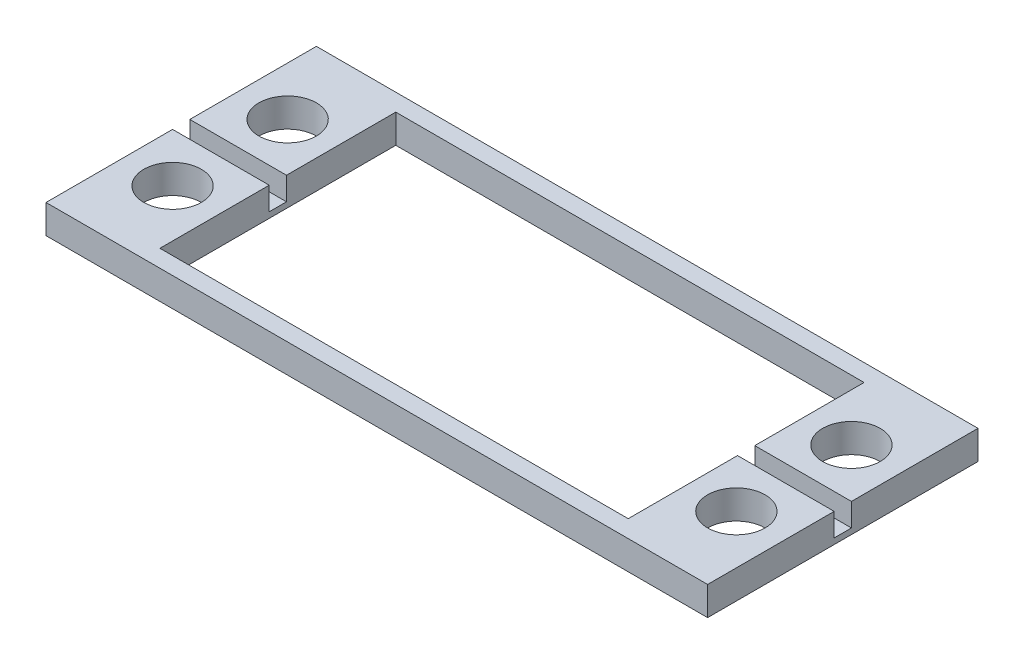
ISO-10303-21;
HEADER;
FILE_DESCRIPTION(('STEP AP214'),'2;1');
FILE_NAME('part.step','',(''),(''),'','','');
FILE_SCHEMA(('AUTOMOTIVE_DESIGN { 1 0 10303 214 1 1 1 1 }'));
ENDSEC;
DATA;
#1=APPLICATION_CONTEXT('core data for automotive mechanical design processes');
#2=APPLICATION_PROTOCOL_DEFINITION('international standard','automotive_design',2000,#1);
#3=PRODUCT_CONTEXT('',#1,'mechanical');
#4=PRODUCT('Part','Part','',(#3));
#5=PRODUCT_RELATED_PRODUCT_CATEGORY('part','',(#4));
#6=PRODUCT_DEFINITION_FORMATION('','',#4);
#7=PRODUCT_DEFINITION_CONTEXT('part definition',#1,'design');
#8=PRODUCT_DEFINITION('design','',#6,#7);
#9=PRODUCT_DEFINITION_SHAPE('','',#8);
#10=(LENGTH_UNIT() NAMED_UNIT(*) SI_UNIT(.MILLI.,.METRE.));
#11=(NAMED_UNIT(*) PLANE_ANGLE_UNIT() SI_UNIT($,.RADIAN.));
#12=(NAMED_UNIT(*) SI_UNIT($,.STERADIAN.) SOLID_ANGLE_UNIT());
#13=UNCERTAINTY_MEASURE_WITH_UNIT(LENGTH_MEASURE(1.E-05),#10,'distance_accuracy_value','');
#14=(GEOMETRIC_REPRESENTATION_CONTEXT(3) GLOBAL_UNCERTAINTY_ASSIGNED_CONTEXT((#13)) GLOBAL_UNIT_ASSIGNED_CONTEXT((#10,
#11,#12)) REPRESENTATION_CONTEXT('',''));
#15=CARTESIAN_POINT('',(0.,0.,0.));
#16=DIRECTION('',(0.,0.,1.));
#17=DIRECTION('',(1.,0.,0.));
#18=AXIS2_PLACEMENT_3D('',#15,#16,#17);
#19=CARTESIAN_POINT('',(0.,2.5,0.));
#20=DIRECTION('',(0.,-1.,0.));
#21=DIRECTION('',(0.,0.,-1.));
#22=AXIS2_PLACEMENT_3D('',#19,#20,#21);
#23=PLANE('',#22);
#24=CARTESIAN_POINT('',(-72.4290830339133,2.5,-41.8099213211178));
#25=DIRECTION('',(0.,1.,0.));
#26=DIRECTION('',(0.,0.,-1.));
#27=AXIS2_PLACEMENT_3D('',#24,#25,#26);
#28=CIRCLE('',#27,2.5);
#29=CARTESIAN_POINT('',(-72.4290830339133,2.5,-44.3099213211178));
#30=VERTEX_POINT('',#29);
#31=EDGE_CURVE('E197',#30,#30,#28,.T.);
#32=ORIENTED_EDGE('',*,*,#31,.F.);
#33=EDGE_LOOP('',(#32));
#34=FACE_BOUND('',#33,.T.);
#35=CARTESIAN_POINT('',(-23.4290830339133,2.5,-41.8099213211178));
#36=DIRECTION('',(0.,1.,0.));
#37=DIRECTION('',(0.,0.,1.));
#38=AXIS2_PLACEMENT_3D('',#35,#36,#37);
#39=CIRCLE('',#38,2.5);
#40=CARTESIAN_POINT('',(-23.4290830339133,2.5,-39.3099213211178));
#41=VERTEX_POINT('',#40);
#42=EDGE_CURVE('E217',#41,#41,#39,.T.);
#43=ORIENTED_EDGE('',*,*,#42,.F.);
#44=EDGE_LOOP('',(#43));
#45=FACE_BOUND('',#44,.T.);
#46=DIRECTION('',(0.,0.,-1.));
#47=VECTOR('',#46,1.);
#48=CARTESIAN_POINT('',(-27.5790830339133,2.5,-47.0599213211178));
#49=LINE('',#48,#47);
#50=CARTESIAN_POINT('',(-27.5790830339133,2.5,-37.5599213211178));
#51=VERTEX_POINT('',#50);
#52=CARTESIAN_POINT('',(-27.5790830339133,2.5,-47.0599213211178));
#53=VERTEX_POINT('',#52);
#54=EDGE_CURVE('E225',#51,#53,#49,.T.);
#55=ORIENTED_EDGE('',*,*,#54,.F.);
#56=DIRECTION('',(-1.,0.,0.));
#57=VECTOR('',#56,1.);
#58=CARTESIAN_POINT('',(-19.1790830339133,2.5,-37.5599213211178));
#59=LINE('',#58,#57);
#60=CARTESIAN_POINT('',(-19.1790830339133,2.5,-37.5599213211178));
#61=VERTEX_POINT('',#60);
#62=EDGE_CURVE('E153',#61,#51,#59,.T.);
#63=ORIENTED_EDGE('',*,*,#62,.F.);
#64=DIRECTION('',(0.,0.,-1.));
#65=VECTOR('',#64,1.);
#66=CARTESIAN_POINT('',(-19.1790830339133,2.5,-25.0599213211178));
#67=LINE('',#66,#65);
#68=CARTESIAN_POINT('',(-19.1790830339133,2.5,-48.5599213211178));
#69=VERTEX_POINT('',#68);
#70=EDGE_CURVE('E259',#61,#69,#67,.T.);
#71=ORIENTED_EDGE('',*,*,#70,.T.);
#72=DIRECTION('',(-1.,0.,0.));
#73=VECTOR('',#72,1.);
#74=CARTESIAN_POINT('',(-76.6790830339133,2.5,-48.5599213211178));
#75=LINE('',#74,#73);
#76=CARTESIAN_POINT('',(-76.6790830339133,2.5,-48.5599213211178));
#77=VERTEX_POINT('',#76);
#78=EDGE_CURVE('E258',#69,#77,#75,.T.);
#79=ORIENTED_EDGE('',*,*,#78,.T.);
#80=DIRECTION('',(0.,0.,1.));
#81=VECTOR('',#80,1.);
#82=CARTESIAN_POINT('',(-76.6790830339133,2.5,-25.0599213211178));
#83=LINE('',#82,#81);
#84=CARTESIAN_POINT('',(-76.6790830339133,2.5,-37.5599213211179));
#85=VERTEX_POINT('',#84);
#86=EDGE_CURVE('E262',#77,#85,#83,.T.);
#87=ORIENTED_EDGE('',*,*,#86,.T.);
#88=DIRECTION('',(-1.,0.,0.));
#89=VECTOR('',#88,1.);
#90=CARTESIAN_POINT('',(-76.6790830339133,2.5,-37.5599213211179));
#91=LINE('',#90,#89);
#92=CARTESIAN_POINT('',(-68.2790830339133,2.5,-37.5599213211179));
#93=VERTEX_POINT('',#92);
#94=EDGE_CURVE('E176',#93,#85,#91,.T.);
#95=ORIENTED_EDGE('',*,*,#94,.F.);
#96=DIRECTION('',(0.,0.,1.));
#97=VECTOR('',#96,1.);
#98=CARTESIAN_POINT('',(-68.2790830339133,2.5,-47.0599213211178));
#99=LINE('',#98,#97);
#100=CARTESIAN_POINT('',(-68.2790830339133,2.5,-47.0599213211178));
#101=VERTEX_POINT('',#100);
#102=EDGE_CURVE('E228',#101,#93,#99,.T.);
#103=ORIENTED_EDGE('',*,*,#102,.F.);
#104=DIRECTION('',(-1.,0.,0.));
#105=VECTOR('',#104,1.);
#106=CARTESIAN_POINT('',(-68.2790830339133,2.5,-47.0599213211178));
#107=LINE('',#106,#105);
#108=EDGE_CURVE('E224',#53,#101,#107,.T.);
#109=ORIENTED_EDGE('',*,*,#108,.F.);
#110=EDGE_LOOP('',(#55,#63,#71,#79,#87,#95,#103,#109));
#111=FACE_BOUND('',#110,.T.);
#112=ADVANCED_FACE('F33',(#34,#45,#111),#23,.F.);
#113=CARTESIAN_POINT('',(-19.1790830339133,2.5,-25.0599213211178));
#114=VERTEX_POINT('',#113);
#115=CARTESIAN_POINT('',(-19.1790830339133,2.5,-36.0599213211178));
#116=VERTEX_POINT('',#115);
#117=EDGE_CURVE('E255',#114,#116,#67,.T.);
#118=ORIENTED_EDGE('',*,*,#117,.T.);
#119=DIRECTION('',(1.,0.,0.));
#120=VECTOR('',#119,1.);
#121=CARTESIAN_POINT('',(-27.5790830339133,2.5,-36.0599213211178));
#122=LINE('',#121,#120);
#123=CARTESIAN_POINT('',(-27.5790830339133,2.5,-36.0599213211178));
#124=VERTEX_POINT('',#123);
#125=EDGE_CURVE('E190',#124,#116,#122,.T.);
#126=ORIENTED_EDGE('',*,*,#125,.F.);
#127=CARTESIAN_POINT('',(-27.5790830339133,2.5,-26.5599213211178));
#128=VERTEX_POINT('',#127);
#129=EDGE_CURVE('E167',#128,#124,#49,.T.);
#130=ORIENTED_EDGE('',*,*,#129,.F.);
#131=DIRECTION('',(1.,0.,0.));
#132=VECTOR('',#131,1.);
#133=CARTESIAN_POINT('',(-68.2790830339133,2.5,-26.5599213211178));
#134=LINE('',#133,#132);
#135=CARTESIAN_POINT('',(-68.2790830339133,2.5,-26.5599213211178));
#136=VERTEX_POINT('',#135);
#137=EDGE_CURVE('E231',#136,#128,#134,.T.);
#138=ORIENTED_EDGE('',*,*,#137,.F.);
#139=CARTESIAN_POINT('',(-68.2790830339133,2.5,-36.0599213211179));
#140=VERTEX_POINT('',#139);
#141=EDGE_CURVE('E227',#140,#136,#99,.T.);
#142=ORIENTED_EDGE('',*,*,#141,.F.);
#143=DIRECTION('',(1.,0.,0.));
#144=VECTOR('',#143,1.);
#145=CARTESIAN_POINT('',(-68.2790830339133,2.5,-36.0599213211179));
#146=LINE('',#145,#144);
#147=CARTESIAN_POINT('',(-76.6790830339133,2.5,-36.0599213211179));
#148=VERTEX_POINT('',#147);
#149=EDGE_CURVE('E184',#148,#140,#146,.T.);
#150=ORIENTED_EDGE('',*,*,#149,.F.);
#151=CARTESIAN_POINT('',(-76.6790830339133,2.5,-25.0599213211178));
#152=VERTEX_POINT('',#151);
#153=EDGE_CURVE('E261',#148,#152,#83,.T.);
#154=ORIENTED_EDGE('',*,*,#153,.T.);
#155=DIRECTION('',(1.,0.,0.));
#156=VECTOR('',#155,1.);
#157=CARTESIAN_POINT('',(-76.6790830339133,2.5,-25.0599213211178));
#158=LINE('',#157,#156);
#159=EDGE_CURVE('E265',#152,#114,#158,.T.);
#160=ORIENTED_EDGE('',*,*,#159,.T.);
#161=EDGE_LOOP('',(#118,#126,#130,#138,#142,#150,#154,#160));
#162=FACE_BOUND('',#161,.T.);
#163=CARTESIAN_POINT('',(-23.4290830339133,2.5,-31.8099213211178));
#164=DIRECTION('',(0.,1.,0.));
#165=DIRECTION('',(0.,0.,-1.));
#166=AXIS2_PLACEMENT_3D('',#163,#164,#165);
#167=CIRCLE('',#166,2.5);
#168=CARTESIAN_POINT('',(-23.4290830339133,2.5,-34.3099213211178));
#169=VERTEX_POINT('',#168);
#170=EDGE_CURVE('E211',#169,#169,#167,.T.);
#171=ORIENTED_EDGE('',*,*,#170,.F.);
#172=EDGE_LOOP('',(#171));
#173=FACE_BOUND('',#172,.T.);
#174=CARTESIAN_POINT('',(-72.4290830339133,2.5,-31.8099213211178));
#175=DIRECTION('',(0.,1.,0.));
#176=DIRECTION('',(0.,0.,1.));
#177=AXIS2_PLACEMENT_3D('',#174,#175,#176);
#178=CIRCLE('',#177,2.49999999999999);
#179=CARTESIAN_POINT('',(-72.4290830339133,2.5,-29.3099213211179));
#180=VERTEX_POINT('',#179);
#181=EDGE_CURVE('E205',#180,#180,#178,.T.);
#182=ORIENTED_EDGE('',*,*,#181,.F.);
#183=EDGE_LOOP('',(#182));
#184=FACE_BOUND('',#183,.T.);
#185=ADVANCED_FACE('F304',(#162,#173,#184),#23,.F.);
#186=CARTESIAN_POINT('',(0.,0.,0.));
#187=DIRECTION('',(0.,-1.,0.));
#188=DIRECTION('',(0.,0.,-1.));
#189=AXIS2_PLACEMENT_3D('',#186,#187,#188);
#190=PLANE('',#189);
#191=CARTESIAN_POINT('',(-72.4290830339133,0.,-31.8099213211178));
#192=DIRECTION('',(0.,1.,0.));
#193=DIRECTION('',(0.,0.,1.));
#194=AXIS2_PLACEMENT_3D('',#191,#192,#193);
#195=CIRCLE('',#194,2.49999999999999);
#196=CARTESIAN_POINT('',(-72.4290830339133,0.,-29.3099213211179));
#197=VERTEX_POINT('',#196);
#198=EDGE_CURVE('E200',#197,#197,#195,.T.);
#199=ORIENTED_EDGE('',*,*,#198,.T.);
#200=EDGE_LOOP('',(#199));
#201=FACE_BOUND('',#200,.T.);
#202=CARTESIAN_POINT('',(-23.4290830339133,0.,-41.8099213211178));
#203=DIRECTION('',(0.,1.,0.));
#204=DIRECTION('',(0.,0.,1.));
#205=AXIS2_PLACEMENT_3D('',#202,#203,#204);
#206=CIRCLE('',#205,2.5);
#207=CARTESIAN_POINT('',(-23.4290830339133,0.,-39.3099213211178));
#208=VERTEX_POINT('',#207);
#209=EDGE_CURVE('E214',#208,#208,#206,.T.);
#210=ORIENTED_EDGE('',*,*,#209,.T.);
#211=EDGE_LOOP('',(#210));
#212=FACE_BOUND('',#211,.T.);
#213=DIRECTION('',(0.,0.,-1.));
#214=VECTOR('',#213,1.);
#215=CARTESIAN_POINT('',(-19.1790830339133,0.,-25.0599213211178));
#216=LINE('',#215,#214);
#217=CARTESIAN_POINT('',(-19.1790830339133,0.,-25.0599213211178));
#218=VERTEX_POINT('',#217);
#219=CARTESIAN_POINT('',(-19.1790830339133,0.,-48.5599213211178));
#220=VERTEX_POINT('',#219);
#221=EDGE_CURVE('E254',#218,#220,#216,.T.);
#222=ORIENTED_EDGE('',*,*,#221,.F.);
#223=DIRECTION('',(1.,0.,0.));
#224=VECTOR('',#223,1.);
#225=CARTESIAN_POINT('',(-76.6790830339133,0.,-25.0599213211178));
#226=LINE('',#225,#224);
#227=CARTESIAN_POINT('',(-76.6790830339133,0.,-25.0599213211178));
#228=VERTEX_POINT('',#227);
#229=EDGE_CURVE('E274',#228,#218,#226,.T.);
#230=ORIENTED_EDGE('',*,*,#229,.F.);
#231=DIRECTION('',(0.,0.,1.));
#232=VECTOR('',#231,1.);
#233=CARTESIAN_POINT('',(-76.6790830339133,0.,-25.0599213211178));
#234=LINE('',#233,#232);
#235=CARTESIAN_POINT('',(-76.6790830339133,0.,-48.5599213211178));
#236=VERTEX_POINT('',#235);
#237=EDGE_CURVE('E272',#236,#228,#234,.T.);
#238=ORIENTED_EDGE('',*,*,#237,.F.);
#239=DIRECTION('',(-1.,0.,0.));
#240=VECTOR('',#239,1.);
#241=CARTESIAN_POINT('',(-76.6790830339133,0.,-48.5599213211178));
#242=LINE('',#241,#240);
#243=EDGE_CURVE('E270',#220,#236,#242,.T.);
#244=ORIENTED_EDGE('',*,*,#243,.F.);
#245=EDGE_LOOP('',(#222,#230,#238,#244));
#246=FACE_BOUND('',#245,.T.);
#247=DIRECTION('',(1.,0.,0.));
#248=VECTOR('',#247,1.);
#249=CARTESIAN_POINT('',(-68.2790830339133,0.,-26.5599213211178));
#250=LINE('',#249,#248);
#251=CARTESIAN_POINT('',(-68.2790830339133,0.,-26.5599213211178));
#252=VERTEX_POINT('',#251);
#253=CARTESIAN_POINT('',(-27.5790830339133,0.,-26.5599213211178));
#254=VERTEX_POINT('',#253);
#255=EDGE_CURVE('E242',#252,#254,#250,.T.);
#256=ORIENTED_EDGE('',*,*,#255,.T.);
#257=DIRECTION('',(0.,0.,-1.));
#258=VECTOR('',#257,1.);
#259=CARTESIAN_POINT('',(-27.5790830339133,0.,-47.0599213211178));
#260=LINE('',#259,#258);
#261=CARTESIAN_POINT('',(-27.5790830339133,0.,-47.0599213211178));
#262=VERTEX_POINT('',#261);
#263=EDGE_CURVE('E220',#254,#262,#260,.T.);
#264=ORIENTED_EDGE('',*,*,#263,.T.);
#265=DIRECTION('',(-1.,0.,0.));
#266=VECTOR('',#265,1.);
#267=CARTESIAN_POINT('',(-68.2790830339133,0.,-47.0599213211178));
#268=LINE('',#267,#266);
#269=CARTESIAN_POINT('',(-68.2790830339133,0.,-47.0599213211178));
#270=VERTEX_POINT('',#269);
#271=EDGE_CURVE('E236',#262,#270,#268,.T.);
#272=ORIENTED_EDGE('',*,*,#271,.T.);
#273=DIRECTION('',(0.,0.,1.));
#274=VECTOR('',#273,1.);
#275=CARTESIAN_POINT('',(-68.2790830339133,0.,-47.0599213211178));
#276=LINE('',#275,#274);
#277=EDGE_CURVE('E239',#270,#252,#276,.T.);
#278=ORIENTED_EDGE('',*,*,#277,.T.);
#279=EDGE_LOOP('',(#256,#264,#272,#278));
#280=FACE_BOUND('',#279,.T.);
#281=CARTESIAN_POINT('',(-23.4290830339133,0.,-31.8099213211178));
#282=DIRECTION('',(0.,1.,0.));
#283=DIRECTION('',(0.,0.,-1.));
#284=AXIS2_PLACEMENT_3D('',#281,#282,#283);
#285=CIRCLE('',#284,2.5);
#286=CARTESIAN_POINT('',(-23.4290830339133,0.,-34.3099213211178));
#287=VERTEX_POINT('',#286);
#288=EDGE_CURVE('E208',#287,#287,#285,.T.);
#289=ORIENTED_EDGE('',*,*,#288,.T.);
#290=EDGE_LOOP('',(#289));
#291=FACE_BOUND('',#290,.T.);
#292=CARTESIAN_POINT('',(-72.4290830339133,0.,-41.8099213211178));
#293=DIRECTION('',(0.,1.,0.));
#294=DIRECTION('',(0.,0.,-1.));
#295=AXIS2_PLACEMENT_3D('',#292,#293,#294);
#296=CIRCLE('',#295,2.5);
#297=CARTESIAN_POINT('',(-72.4290830339133,0.,-44.3099213211178));
#298=VERTEX_POINT('',#297);
#299=EDGE_CURVE('E201',#298,#298,#296,.T.);
#300=ORIENTED_EDGE('',*,*,#299,.T.);
#301=EDGE_LOOP('',(#300));
#302=FACE_BOUND('',#301,.T.);
#303=ADVANCED_FACE('F293',(#201,#212,#246,#280,#291,#302),#190,.T.);
#304=CARTESIAN_POINT('',(-19.1790830339133,2.5,-25.0599213211178));
#305=DIRECTION('',(-1.,0.,0.));
#306=DIRECTION('',(0.,0.,1.));
#307=AXIS2_PLACEMENT_3D('',#304,#305,#306);
#308=PLANE('',#307);
#309=ORIENTED_EDGE('',*,*,#70,.F.);
#310=DIRECTION('',(0.,1.,0.));
#311=VECTOR('',#310,1.);
#312=CARTESIAN_POINT('',(-19.1790830339133,0.5,-37.5599213211178));
#313=LINE('',#312,#311);
#314=CARTESIAN_POINT('',(-19.1790830339133,0.5,-37.5599213211178));
#315=VERTEX_POINT('',#314);
#316=EDGE_CURVE('E169',#315,#61,#313,.T.);
#317=ORIENTED_EDGE('',*,*,#316,.F.);
#318=DIRECTION('',(0.,0.,-1.));
#319=VECTOR('',#318,1.);
#320=CARTESIAN_POINT('',(-19.1790830339133,0.5,-36.0599213211178));
#321=LINE('',#320,#319);
#322=CARTESIAN_POINT('',(-19.1790830339133,0.5,-36.0599213211178));
#323=VERTEX_POINT('',#322);
#324=EDGE_CURVE('E161',#323,#315,#321,.T.);
#325=ORIENTED_EDGE('',*,*,#324,.F.);
#326=DIRECTION('',(0.,1.,0.));
#327=VECTOR('',#326,1.);
#328=CARTESIAN_POINT('',(-19.1790830339133,0.5,-36.0599213211178));
#329=LINE('',#328,#327);
#330=EDGE_CURVE('E160',#323,#116,#329,.T.);
#331=ORIENTED_EDGE('',*,*,#330,.T.);
#332=ORIENTED_EDGE('',*,*,#117,.F.);
#333=DIRECTION('',(0.,-1.,0.));
#334=VECTOR('',#333,1.);
#335=CARTESIAN_POINT('',(-19.1790830339133,2.5,-25.0599213211178));
#336=LINE('',#335,#334);
#337=EDGE_CURVE('E267',#114,#218,#336,.T.);
#338=ORIENTED_EDGE('',*,*,#337,.T.);
#339=ORIENTED_EDGE('',*,*,#221,.T.);
#340=DIRECTION('',(0.,-1.,0.));
#341=VECTOR('',#340,1.);
#342=CARTESIAN_POINT('',(-19.1790830339133,2.5,-48.5599213211178));
#343=LINE('',#342,#341);
#344=EDGE_CURVE('E11',#69,#220,#343,.T.);
#345=ORIENTED_EDGE('',*,*,#344,.F.);
#346=EDGE_LOOP('',(#309,#317,#325,#331,#332,#338,#339,#345));
#347=FACE_BOUND('',#346,.T.);
#348=ADVANCED_FACE('F35',(#347),#308,.F.);
#349=CARTESIAN_POINT('',(-76.6790830339133,2.5,-48.5599213211178));
#350=DIRECTION('',(0.,0.,1.));
#351=DIRECTION('',(1.,0.,0.));
#352=AXIS2_PLACEMENT_3D('',#349,#350,#351);
#353=PLANE('',#352);
#354=ORIENTED_EDGE('',*,*,#243,.T.);
#355=DIRECTION('',(0.,-1.,0.));
#356=VECTOR('',#355,1.);
#357=CARTESIAN_POINT('',(-76.6790830339133,2.5,-48.5599213211178));
#358=LINE('',#357,#356);
#359=EDGE_CURVE('E41',#77,#236,#358,.T.);
#360=ORIENTED_EDGE('',*,*,#359,.F.);
#361=ORIENTED_EDGE('',*,*,#78,.F.);
#362=ORIENTED_EDGE('',*,*,#344,.T.);
#363=EDGE_LOOP('',(#354,#360,#361,#362));
#364=FACE_BOUND('',#363,.T.);
#365=ADVANCED_FACE('F328',(#364),#353,.F.);
#366=CARTESIAN_POINT('',(-76.6790830339133,2.5,-25.0599213211178));
#367=DIRECTION('',(1.,0.,0.));
#368=DIRECTION('',(0.,0.,-1.));
#369=AXIS2_PLACEMENT_3D('',#366,#367,#368);
#370=PLANE('',#369);
#371=DIRECTION('',(0.,0.,1.));
#372=VECTOR('',#371,1.);
#373=CARTESIAN_POINT('',(-76.6790830339133,0.5,-36.0599213211179));
#374=LINE('',#373,#372);
#375=CARTESIAN_POINT('',(-76.6790830339133,0.5,-37.5599213211179));
#376=VERTEX_POINT('',#375);
#377=CARTESIAN_POINT('',(-76.6790830339133,0.5,-36.0599213211179));
#378=VERTEX_POINT('',#377);
#379=EDGE_CURVE('E174',#376,#378,#374,.T.);
#380=ORIENTED_EDGE('',*,*,#379,.F.);
#381=DIRECTION('',(0.,1.,0.));
#382=VECTOR('',#381,1.);
#383=CARTESIAN_POINT('',(-76.6790830339133,0.5,-37.5599213211179));
#384=LINE('',#383,#382);
#385=EDGE_CURVE('E187',#376,#85,#384,.T.);
#386=ORIENTED_EDGE('',*,*,#385,.T.);
#387=ORIENTED_EDGE('',*,*,#86,.F.);
#388=ORIENTED_EDGE('',*,*,#359,.T.);
#389=ORIENTED_EDGE('',*,*,#237,.T.);
#390=DIRECTION('',(0.,-1.,0.));
#391=VECTOR('',#390,1.);
#392=CARTESIAN_POINT('',(-76.6790830339133,2.5,-25.0599213211178));
#393=LINE('',#392,#391);
#394=EDGE_CURVE('E278',#152,#228,#393,.T.);
#395=ORIENTED_EDGE('',*,*,#394,.F.);
#396=ORIENTED_EDGE('',*,*,#153,.F.);
#397=DIRECTION('',(0.,1.,0.));
#398=VECTOR('',#397,1.);
#399=CARTESIAN_POINT('',(-76.6790830339133,0.5,-36.0599213211179));
#400=LINE('',#399,#398);
#401=EDGE_CURVE('E183',#378,#148,#400,.T.);
#402=ORIENTED_EDGE('',*,*,#401,.F.);
#403=EDGE_LOOP('',(#380,#386,#387,#388,#389,#395,#396,#402));
#404=FACE_BOUND('',#403,.T.);
#405=ADVANCED_FACE('F286',(#404),#370,.F.);
#406=CARTESIAN_POINT('',(-76.6790830339133,2.5,-25.0599213211178));
#407=DIRECTION('',(0.,0.,-1.));
#408=DIRECTION('',(-1.,0.,0.));
#409=AXIS2_PLACEMENT_3D('',#406,#407,#408);
#410=PLANE('',#409);
#411=ORIENTED_EDGE('',*,*,#229,.T.);
#412=ORIENTED_EDGE('',*,*,#337,.F.);
#413=ORIENTED_EDGE('',*,*,#159,.F.);
#414=ORIENTED_EDGE('',*,*,#394,.T.);
#415=EDGE_LOOP('',(#411,#412,#413,#414));
#416=FACE_BOUND('',#415,.T.);
#417=ADVANCED_FACE('F297',(#416),#410,.F.);
#418=CARTESIAN_POINT('',(-27.5790830339133,2.5,-47.0599213211178));
#419=DIRECTION('',(-1.,0.,0.));
#420=DIRECTION('',(0.,0.,1.));
#421=AXIS2_PLACEMENT_3D('',#418,#419,#420);
#422=PLANE('',#421);
#423=DIRECTION('',(0.,1.,0.));
#424=VECTOR('',#423,1.);
#425=CARTESIAN_POINT('',(-27.5790830339133,0.5,-37.5599213211178));
#426=LINE('',#425,#424);
#427=CARTESIAN_POINT('',(-27.5790830339133,0.5,-37.5599213211178));
#428=VERTEX_POINT('',#427);
#429=EDGE_CURVE('E204',#428,#51,#426,.T.);
#430=ORIENTED_EDGE('',*,*,#429,.T.);
#431=ORIENTED_EDGE('',*,*,#54,.T.);
#432=DIRECTION('',(0.,-1.,0.));
#433=VECTOR('',#432,1.);
#434=CARTESIAN_POINT('',(-27.5790830339133,2.5,-47.0599213211178));
#435=LINE('',#434,#433);
#436=EDGE_CURVE('E251',#53,#262,#435,.T.);
#437=ORIENTED_EDGE('',*,*,#436,.T.);
#438=ORIENTED_EDGE('',*,*,#263,.F.);
#439=DIRECTION('',(0.,-1.,0.));
#440=VECTOR('',#439,1.);
#441=CARTESIAN_POINT('',(-27.5790830339133,2.5,-26.5599213211178));
#442=LINE('',#441,#440);
#443=EDGE_CURVE('E233',#128,#254,#442,.T.);
#444=ORIENTED_EDGE('',*,*,#443,.F.);
#445=ORIENTED_EDGE('',*,*,#129,.T.);
#446=DIRECTION('',(0.,1.,0.));
#447=VECTOR('',#446,1.);
#448=CARTESIAN_POINT('',(-27.5790830339133,0.5,-36.0599213211178));
#449=LINE('',#448,#447);
#450=CARTESIAN_POINT('',(-27.5790830339133,0.5,-36.0599213211178));
#451=VERTEX_POINT('',#450);
#452=EDGE_CURVE('E157',#451,#124,#449,.T.);
#453=ORIENTED_EDGE('',*,*,#452,.F.);
#454=DIRECTION('',(0.,0.,1.));
#455=VECTOR('',#454,1.);
#456=CARTESIAN_POINT('',(-27.5790830339133,0.5,-36.8099213211178));
#457=LINE('',#456,#455);
#458=EDGE_CURVE('E145',#428,#451,#457,.T.);
#459=ORIENTED_EDGE('',*,*,#458,.F.);
#460=EDGE_LOOP('',(#430,#431,#437,#438,#444,#445,#453,#459));
#461=FACE_BOUND('',#460,.T.);
#462=ADVANCED_FACE('F164',(#461),#422,.T.);
#463=CARTESIAN_POINT('',(-68.2790830339133,2.5,-47.0599213211178));
#464=DIRECTION('',(0.,0.,1.));
#465=DIRECTION('',(1.,0.,0.));
#466=AXIS2_PLACEMENT_3D('',#463,#464,#465);
#467=PLANE('',#466);
#468=ORIENTED_EDGE('',*,*,#271,.F.);
#469=ORIENTED_EDGE('',*,*,#436,.F.);
#470=ORIENTED_EDGE('',*,*,#108,.T.);
#471=DIRECTION('',(0.,-1.,0.));
#472=VECTOR('',#471,1.);
#473=CARTESIAN_POINT('',(-68.2790830339133,2.5,-47.0599213211178));
#474=LINE('',#473,#472);
#475=EDGE_CURVE('E249',#101,#270,#474,.T.);
#476=ORIENTED_EDGE('',*,*,#475,.T.);
#477=EDGE_LOOP('',(#468,#469,#470,#476));
#478=FACE_BOUND('',#477,.T.);
#479=ADVANCED_FACE('F338',(#478),#467,.T.);
#480=CARTESIAN_POINT('',(-68.2790830339133,2.5,-47.0599213211178));
#481=DIRECTION('',(1.,0.,0.));
#482=DIRECTION('',(0.,0.,-1.));
#483=AXIS2_PLACEMENT_3D('',#480,#481,#482);
#484=PLANE('',#483);
#485=DIRECTION('',(0.,1.,0.));
#486=VECTOR('',#485,1.);
#487=CARTESIAN_POINT('',(-68.2790830339133,0.5,-37.5599213211179));
#488=LINE('',#487,#486);
#489=CARTESIAN_POINT('',(-68.2790830339133,0.5,-37.5599213211179));
#490=VERTEX_POINT('',#489);
#491=EDGE_CURVE('E191',#490,#93,#488,.T.);
#492=ORIENTED_EDGE('',*,*,#491,.F.);
#493=DIRECTION('',(0.,0.,-1.));
#494=VECTOR('',#493,1.);
#495=CARTESIAN_POINT('',(-68.2790830339133,0.5,-36.8099213211179));
#496=LINE('',#495,#494);
#497=CARTESIAN_POINT('',(-68.2790830339133,0.5,-36.0599213211179));
#498=VERTEX_POINT('',#497);
#499=EDGE_CURVE('E178',#498,#490,#496,.T.);
#500=ORIENTED_EDGE('',*,*,#499,.F.);
#501=DIRECTION('',(0.,1.,0.));
#502=VECTOR('',#501,1.);
#503=CARTESIAN_POINT('',(-68.2790830339133,0.5,-36.0599213211179));
#504=LINE('',#503,#502);
#505=EDGE_CURVE('E193',#498,#140,#504,.T.);
#506=ORIENTED_EDGE('',*,*,#505,.T.);
#507=ORIENTED_EDGE('',*,*,#141,.T.);
#508=DIRECTION('',(0.,-1.,0.));
#509=VECTOR('',#508,1.);
#510=CARTESIAN_POINT('',(-68.2790830339133,2.5,-26.5599213211178));
#511=LINE('',#510,#509);
#512=EDGE_CURVE('E247',#136,#252,#511,.T.);
#513=ORIENTED_EDGE('',*,*,#512,.T.);
#514=ORIENTED_EDGE('',*,*,#277,.F.);
#515=ORIENTED_EDGE('',*,*,#475,.F.);
#516=ORIENTED_EDGE('',*,*,#102,.T.);
#517=EDGE_LOOP('',(#492,#500,#506,#507,#513,#514,#515,#516));
#518=FACE_BOUND('',#517,.T.);
#519=ADVANCED_FACE('F320',(#518),#484,.T.);
#520=CARTESIAN_POINT('',(-68.2790830339133,2.5,-26.5599213211178));
#521=DIRECTION('',(0.,0.,-1.));
#522=DIRECTION('',(-1.,0.,0.));
#523=AXIS2_PLACEMENT_3D('',#520,#521,#522);
#524=PLANE('',#523);
#525=ORIENTED_EDGE('',*,*,#255,.F.);
#526=ORIENTED_EDGE('',*,*,#512,.F.);
#527=ORIENTED_EDGE('',*,*,#137,.T.);
#528=ORIENTED_EDGE('',*,*,#443,.T.);
#529=EDGE_LOOP('',(#525,#526,#527,#528));
#530=FACE_BOUND('',#529,.T.);
#531=ADVANCED_FACE('F342',(#530),#524,.T.);
#532=CARTESIAN_POINT('',(-23.4290830339133,2.5,-41.8099213211178));
#533=DIRECTION('',(0.,-1.,0.));
#534=DIRECTION('',(0.,0.,-1.));
#535=AXIS2_PLACEMENT_3D('',#532,#533,#534);
#536=CYLINDRICAL_SURFACE('',#535,2.5);
#537=ORIENTED_EDGE('',*,*,#42,.T.);
#538=EDGE_LOOP('',(#537));
#539=FACE_BOUND('',#538,.T.);
#540=ORIENTED_EDGE('',*,*,#209,.F.);
#541=EDGE_LOOP('',(#540));
#542=FACE_BOUND('',#541,.T.);
#543=ADVANCED_FACE('F346',(#539,#542),#536,.F.);
#544=CARTESIAN_POINT('',(-23.4290830339133,2.5,-31.8099213211178));
#545=DIRECTION('',(0.,-1.,0.));
#546=DIRECTION('',(0.,0.,-1.));
#547=AXIS2_PLACEMENT_3D('',#544,#545,#546);
#548=CYLINDRICAL_SURFACE('',#547,2.5);
#549=ORIENTED_EDGE('',*,*,#170,.T.);
#550=EDGE_LOOP('',(#549));
#551=FACE_BOUND('',#550,.T.);
#552=ORIENTED_EDGE('',*,*,#288,.F.);
#553=EDGE_LOOP('',(#552));
#554=FACE_BOUND('',#553,.T.);
#555=ADVANCED_FACE('F352',(#551,#554),#548,.F.);
#556=CARTESIAN_POINT('',(-72.4290830339133,2.5,-31.8099213211178));
#557=DIRECTION('',(0.,-1.,0.));
#558=DIRECTION('',(0.,0.,-1.));
#559=AXIS2_PLACEMENT_3D('',#556,#557,#558);
#560=CYLINDRICAL_SURFACE('',#559,2.49999999999999);
#561=ORIENTED_EDGE('',*,*,#181,.T.);
#562=EDGE_LOOP('',(#561));
#563=FACE_BOUND('',#562,.T.);
#564=ORIENTED_EDGE('',*,*,#198,.F.);
#565=EDGE_LOOP('',(#564));
#566=FACE_BOUND('',#565,.T.);
#567=ADVANCED_FACE('F451',(#563,#566),#560,.F.);
#568=CARTESIAN_POINT('',(-72.4290830339133,2.5,-41.8099213211178));
#569=DIRECTION('',(0.,-1.,0.));
#570=DIRECTION('',(0.,0.,-1.));
#571=AXIS2_PLACEMENT_3D('',#568,#569,#570);
#572=CYLINDRICAL_SURFACE('',#571,2.5);
#573=ORIENTED_EDGE('',*,*,#31,.T.);
#574=EDGE_LOOP('',(#573));
#575=FACE_BOUND('',#574,.T.);
#576=ORIENTED_EDGE('',*,*,#299,.F.);
#577=EDGE_LOOP('',(#576));
#578=FACE_BOUND('',#577,.T.);
#579=ADVANCED_FACE('F403',(#575,#578),#572,.F.);
#580=CARTESIAN_POINT('',(-76.6790830339133,0.5,-37.5599213211179));
#581=DIRECTION('',(0.,0.,-1.));
#582=DIRECTION('',(-1.,0.,0.));
#583=AXIS2_PLACEMENT_3D('',#580,#581,#582);
#584=PLANE('',#583);
#585=ORIENTED_EDGE('',*,*,#94,.T.);
#586=ORIENTED_EDGE('',*,*,#385,.F.);
#587=DIRECTION('',(-1.,0.,0.));
#588=VECTOR('',#587,1.);
#589=CARTESIAN_POINT('',(-76.6790830339133,0.5,-37.5599213211179));
#590=LINE('',#589,#588);
#591=EDGE_CURVE('E180',#490,#376,#590,.T.);
#592=ORIENTED_EDGE('',*,*,#591,.F.);
#593=ORIENTED_EDGE('',*,*,#491,.T.);
#594=EDGE_LOOP('',(#585,#586,#592,#593));
#595=FACE_BOUND('',#594,.T.);
#596=ADVANCED_FACE('F317',(#595),#584,.F.);
#597=CARTESIAN_POINT('',(-68.2790830339133,0.5,-36.0599213211179));
#598=DIRECTION('',(0.,0.,1.));
#599=DIRECTION('',(1.,0.,0.));
#600=AXIS2_PLACEMENT_3D('',#597,#598,#599);
#601=PLANE('',#600);
#602=ORIENTED_EDGE('',*,*,#149,.T.);
#603=ORIENTED_EDGE('',*,*,#505,.F.);
#604=DIRECTION('',(1.,0.,0.));
#605=VECTOR('',#604,1.);
#606=CARTESIAN_POINT('',(-68.2790830339133,0.5,-36.0599213211179));
#607=LINE('',#606,#605);
#608=EDGE_CURVE('E56',#378,#498,#607,.T.);
#609=ORIENTED_EDGE('',*,*,#608,.F.);
#610=ORIENTED_EDGE('',*,*,#401,.T.);
#611=EDGE_LOOP('',(#602,#603,#609,#610));
#612=FACE_BOUND('',#611,.T.);
#613=ADVANCED_FACE('F311',(#612),#601,.F.);
#614=CARTESIAN_POINT('',(0.,0.5,0.));
#615=DIRECTION('',(0.,-1.,0.));
#616=DIRECTION('',(0.,0.,-1.));
#617=AXIS2_PLACEMENT_3D('',#614,#615,#616);
#618=PLANE('',#617);
#619=ORIENTED_EDGE('',*,*,#379,.T.);
#620=ORIENTED_EDGE('',*,*,#608,.T.);
#621=ORIENTED_EDGE('',*,*,#499,.T.);
#622=ORIENTED_EDGE('',*,*,#591,.T.);
#623=EDGE_LOOP('',(#619,#620,#621,#622));
#624=FACE_BOUND('',#623,.T.);
#625=ADVANCED_FACE('F313',(#624),#618,.F.);
#626=CARTESIAN_POINT('',(-19.1790830339133,0.5,-37.5599213211178));
#627=DIRECTION('',(0.,0.,-1.));
#628=DIRECTION('',(-1.,0.,0.));
#629=AXIS2_PLACEMENT_3D('',#626,#627,#628);
#630=PLANE('',#629);
#631=ORIENTED_EDGE('',*,*,#62,.T.);
#632=ORIENTED_EDGE('',*,*,#429,.F.);
#633=DIRECTION('',(-1.,0.,0.));
#634=VECTOR('',#633,1.);
#635=CARTESIAN_POINT('',(-19.1790830339133,0.5,-37.5599213211178));
#636=LINE('',#635,#634);
#637=EDGE_CURVE('E48',#315,#428,#636,.T.);
#638=ORIENTED_EDGE('',*,*,#637,.F.);
#639=ORIENTED_EDGE('',*,*,#316,.T.);
#640=EDGE_LOOP('',(#631,#632,#638,#639));
#641=FACE_BOUND('',#640,.T.);
#642=ADVANCED_FACE('F335',(#641),#630,.F.);
#643=CARTESIAN_POINT('',(-27.5790830339133,0.5,-36.0599213211178));
#644=DIRECTION('',(0.,0.,1.));
#645=DIRECTION('',(1.,0.,0.));
#646=AXIS2_PLACEMENT_3D('',#643,#644,#645);
#647=PLANE('',#646);
#648=ORIENTED_EDGE('',*,*,#125,.T.);
#649=ORIENTED_EDGE('',*,*,#330,.F.);
#650=DIRECTION('',(1.,0.,0.));
#651=VECTOR('',#650,1.);
#652=CARTESIAN_POINT('',(-27.5790830339133,0.5,-36.0599213211178));
#653=LINE('',#652,#651);
#654=EDGE_CURVE('E148',#451,#323,#653,.T.);
#655=ORIENTED_EDGE('',*,*,#654,.F.);
#656=ORIENTED_EDGE('',*,*,#452,.T.);
#657=EDGE_LOOP('',(#648,#649,#655,#656));
#658=FACE_BOUND('',#657,.T.);
#659=ADVANCED_FACE('F156',(#658),#647,.F.);
#660=CARTESIAN_POINT('',(0.,0.5,0.));
#661=DIRECTION('',(0.,1.,0.));
#662=DIRECTION('',(0.,0.,1.));
#663=AXIS2_PLACEMENT_3D('',#660,#661,#662);
#664=PLANE('',#663);
#665=ORIENTED_EDGE('',*,*,#458,.T.);
#666=ORIENTED_EDGE('',*,*,#654,.T.);
#667=ORIENTED_EDGE('',*,*,#324,.T.);
#668=ORIENTED_EDGE('',*,*,#637,.T.);
#669=EDGE_LOOP('',(#665,#666,#667,#668));
#670=FACE_BOUND('',#669,.T.);
#671=ADVANCED_FACE('F147',(#670),#664,.T.);
#672=CLOSED_SHELL('',(#112,#185,#303,#348,#365,#405,#417,#462,#479,#519,#531,#543,#555,#567,
#579,#596,#613,#625,#642,#659,#671));
#673=MANIFOLD_SOLID_BREP('B2',#672);
#674=ADVANCED_BREP_SHAPE_REPRESENTATION('',(#18,#673),#14);
#675=SHAPE_DEFINITION_REPRESENTATION(#9,#674);
ENDSEC;
END-ISO-10303-21;
